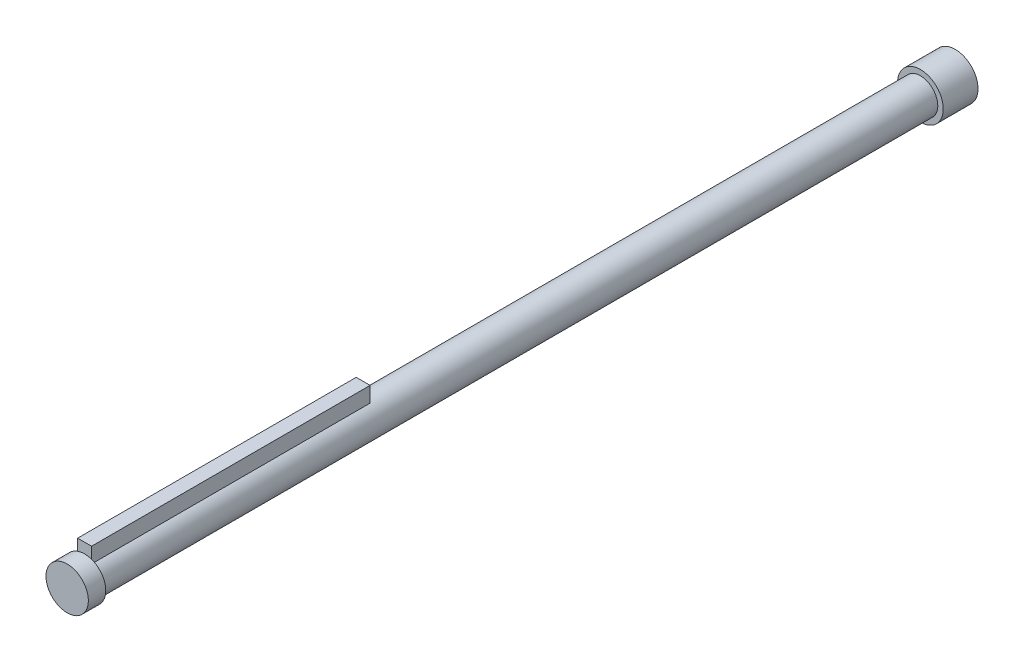
ISO-10303-21;
HEADER;
FILE_DESCRIPTION(('STEP AP214'),'2;1');
FILE_NAME('part.step','',(''),(''),'','','');
FILE_SCHEMA(('AUTOMOTIVE_DESIGN { 1 0 10303 214 1 1 1 1 }'));
ENDSEC;
DATA;
#1=APPLICATION_CONTEXT('core data for automotive mechanical design processes');
#2=APPLICATION_PROTOCOL_DEFINITION('international standard','automotive_design',2000,#1);
#3=PRODUCT_CONTEXT('',#1,'mechanical');
#4=PRODUCT('Part','Part','',(#3));
#5=PRODUCT_RELATED_PRODUCT_CATEGORY('part','',(#4));
#6=PRODUCT_DEFINITION_FORMATION('','',#4);
#7=PRODUCT_DEFINITION_CONTEXT('part definition',#1,'design');
#8=PRODUCT_DEFINITION('design','',#6,#7);
#9=PRODUCT_DEFINITION_SHAPE('','',#8);
#10=(LENGTH_UNIT() NAMED_UNIT(*) SI_UNIT(.MILLI.,.METRE.));
#11=(NAMED_UNIT(*) PLANE_ANGLE_UNIT() SI_UNIT($,.RADIAN.));
#12=(NAMED_UNIT(*) SI_UNIT($,.STERADIAN.) SOLID_ANGLE_UNIT());
#13=UNCERTAINTY_MEASURE_WITH_UNIT(LENGTH_MEASURE(1.E-05),#10,'distance_accuracy_value','');
#14=(GEOMETRIC_REPRESENTATION_CONTEXT(3) GLOBAL_UNCERTAINTY_ASSIGNED_CONTEXT((#13)) GLOBAL_UNIT_ASSIGNED_CONTEXT((#10,
#11,#12)) REPRESENTATION_CONTEXT('',''));
#15=CARTESIAN_POINT('',(0.,0.,0.));
#16=DIRECTION('',(0.,0.,1.));
#17=DIRECTION('',(1.,0.,0.));
#18=AXIS2_PLACEMENT_3D('',#15,#16,#17);
#19=CARTESIAN_POINT('',(0.,0.,152.4));
#20=DIRECTION('',(0.,0.,-1.));
#21=DIRECTION('',(-1.,0.,0.));
#22=AXIS2_PLACEMENT_3D('',#19,#20,#21);
#23=CYLINDRICAL_SURFACE('',#22,3.175);
#24=CARTESIAN_POINT('',(0.,0.,101.6));
#25=DIRECTION('',(0.,0.,1.));
#26=DIRECTION('',(1.,0.,0.));
#27=AXIS2_PLACEMENT_3D('',#24,#25,#26);
#28=CIRCLE('',#27,3.175);
#29=CARTESIAN_POINT('',(1.27,2.90993556629696,101.6));
#30=VERTEX_POINT('',#29);
#31=CARTESIAN_POINT('',(-1.27,2.90993556629696,101.6));
#32=VERTEX_POINT('',#31);
#33=EDGE_CURVE('E11',#30,#32,#28,.T.);
#34=ORIENTED_EDGE('',*,*,#33,.F.);
#35=DIRECTION('',(0.,0.,-1.));
#36=VECTOR('',#35,1.);
#37=CARTESIAN_POINT('',(1.27,2.90993556629696,152.4));
#38=LINE('',#37,#36);
#39=CARTESIAN_POINT('',(1.27,2.90993556629696,152.4));
#40=VERTEX_POINT('',#39);
#41=EDGE_CURVE('E141',#30,#40,#38,.F.);
#42=ORIENTED_EDGE('',*,*,#41,.T.);
#43=CARTESIAN_POINT('',(0.,0.,152.4));
#44=DIRECTION('',(0.,0.,1.));
#45=DIRECTION('',(1.,0.,0.));
#46=AXIS2_PLACEMENT_3D('',#43,#44,#45);
#47=CIRCLE('',#46,3.175);
#48=CARTESIAN_POINT('',(-1.27,2.90993556629696,152.4));
#49=VERTEX_POINT('',#48);
#50=EDGE_CURVE('E56',#49,#40,#47,.T.);
#51=ORIENTED_EDGE('',*,*,#50,.F.);
#52=DIRECTION('',(0.,0.,-1.));
#53=VECTOR('',#52,1.);
#54=CARTESIAN_POINT('',(-1.27,2.90993556629696,152.4));
#55=LINE('',#54,#53);
#56=EDGE_CURVE('E71',#49,#32,#55,.T.);
#57=ORIENTED_EDGE('',*,*,#56,.T.);
#58=EDGE_LOOP('',(#34,#42,#51,#57));
#59=FACE_BOUND('',#58,.T.);
#60=CARTESIAN_POINT('',(0.,0.,0.));
#61=DIRECTION('',(0.,0.,1.));
#62=DIRECTION('',(1.,0.,0.));
#63=AXIS2_PLACEMENT_3D('',#60,#61,#62);
#64=CIRCLE('',#63,3.175);
#65=CARTESIAN_POINT('',(3.175,0.,0.));
#66=VERTEX_POINT('',#65);
#67=EDGE_CURVE('E123',#66,#66,#64,.T.);
#68=ORIENTED_EDGE('',*,*,#67,.T.);
#69=EDGE_LOOP('',(#68));
#70=FACE_BOUND('',#69,.T.);
#71=ADVANCED_FACE('F49',(#59,#70),#23,.T.);
#72=CARTESIAN_POINT('',(0.,0.,152.4));
#73=DIRECTION('',(0.,0.,1.));
#74=DIRECTION('',(1.,0.,0.));
#75=AXIS2_PLACEMENT_3D('',#72,#73,#74);
#76=PLANE('',#75);
#77=CARTESIAN_POINT('',(0.,0.,152.4));
#78=DIRECTION('',(0.,0.,1.));
#79=DIRECTION('',(1.,0.,0.));
#80=AXIS2_PLACEMENT_3D('',#77,#78,#79);
#81=CIRCLE('',#80,3.8610491316399);
#82=CARTESIAN_POINT('',(1.27,3.64620355944881,152.4));
#83=VERTEX_POINT('',#82);
#84=CARTESIAN_POINT('',(-1.27,3.64620355944881,152.4));
#85=VERTEX_POINT('',#84);
#86=EDGE_CURVE('E63',#83,#85,#81,.T.);
#87=ORIENTED_EDGE('',*,*,#86,.F.);
#88=DIRECTION('',(0.,1.,0.));
#89=VECTOR('',#88,1.);
#90=CARTESIAN_POINT('',(1.27,5.715,152.4));
#91=LINE('',#90,#89);
#92=CARTESIAN_POINT('',(1.27,5.715,152.4));
#93=VERTEX_POINT('',#92);
#94=EDGE_CURVE('E134',#83,#93,#91,.T.);
#95=ORIENTED_EDGE('',*,*,#94,.T.);
#96=DIRECTION('',(-1.,0.,0.));
#97=VECTOR('',#96,1.);
#98=CARTESIAN_POINT('',(-1.27,5.715,152.4));
#99=LINE('',#98,#97);
#100=CARTESIAN_POINT('',(-1.27,5.715,152.4));
#101=VERTEX_POINT('',#100);
#102=EDGE_CURVE('E98',#93,#101,#99,.T.);
#103=ORIENTED_EDGE('',*,*,#102,.T.);
#104=DIRECTION('',(0.,-1.,0.));
#105=VECTOR('',#104,1.);
#106=CARTESIAN_POINT('',(-1.27,5.715,152.4));
#107=LINE('',#106,#105);
#108=EDGE_CURVE('E95',#101,#85,#107,.T.);
#109=ORIENTED_EDGE('',*,*,#108,.T.);
#110=EDGE_LOOP('',(#87,#95,#103,#109));
#111=FACE_BOUND('',#110,.T.);
#112=ADVANCED_FACE('F96',(#111),#76,.T.);
#113=CARTESIAN_POINT('',(1.27,5.715,101.6));
#114=DIRECTION('',(1.,0.,0.));
#115=DIRECTION('',(0.,1.,0.));
#116=AXIS2_PLACEMENT_3D('',#113,#114,#115);
#117=PLANE('',#116);
#118=ORIENTED_EDGE('',*,*,#41,.F.);
#119=DIRECTION('',(0.,1.,0.));
#120=VECTOR('',#119,1.);
#121=CARTESIAN_POINT('',(1.27,5.715,101.6));
#122=LINE('',#121,#120);
#123=CARTESIAN_POINT('',(1.27,5.715,101.6));
#124=VERTEX_POINT('',#123);
#125=EDGE_CURVE('E99',#30,#124,#122,.T.);
#126=ORIENTED_EDGE('',*,*,#125,.T.);
#127=DIRECTION('',(0.,0.,1.));
#128=VECTOR('',#127,1.);
#129=CARTESIAN_POINT('',(1.27,5.715,101.6));
#130=LINE('',#129,#128);
#131=EDGE_CURVE('E132',#124,#93,#130,.T.);
#132=ORIENTED_EDGE('',*,*,#131,.T.);
#133=ORIENTED_EDGE('',*,*,#94,.F.);
#134=EDGE_CURVE('E111',#40,#83,#91,.T.);
#135=ORIENTED_EDGE('',*,*,#134,.F.);
#136=EDGE_LOOP('',(#118,#126,#132,#133,#135));
#137=FACE_BOUND('',#136,.T.);
#138=ADVANCED_FACE('F149',(#137),#117,.T.);
#139=CARTESIAN_POINT('',(-1.27,5.715,101.6));
#140=DIRECTION('',(-1.,0.,0.));
#141=DIRECTION('',(0.,-1.,0.));
#142=AXIS2_PLACEMENT_3D('',#139,#140,#141);
#143=PLANE('',#142);
#144=ORIENTED_EDGE('',*,*,#56,.F.);
#145=EDGE_CURVE('E100',#85,#49,#107,.T.);
#146=ORIENTED_EDGE('',*,*,#145,.F.);
#147=ORIENTED_EDGE('',*,*,#108,.F.);
#148=DIRECTION('',(0.,0.,1.));
#149=VECTOR('',#148,1.);
#150=CARTESIAN_POINT('',(-1.27,5.715,101.6));
#151=LINE('',#150,#149);
#152=CARTESIAN_POINT('',(-1.27,5.715,101.6));
#153=VERTEX_POINT('',#152);
#154=EDGE_CURVE('E136',#153,#101,#151,.T.);
#155=ORIENTED_EDGE('',*,*,#154,.F.);
#156=DIRECTION('',(0.,-1.,0.));
#157=VECTOR('',#156,1.);
#158=CARTESIAN_POINT('',(-1.27,5.715,101.6));
#159=LINE('',#158,#157);
#160=EDGE_CURVE('E130',#153,#32,#159,.T.);
#161=ORIENTED_EDGE('',*,*,#160,.T.);
#162=EDGE_LOOP('',(#144,#146,#147,#155,#161));
#163=FACE_BOUND('',#162,.T.);
#164=ADVANCED_FACE('F104',(#163),#143,.T.);
#165=CARTESIAN_POINT('',(-1.27,5.715,101.6));
#166=DIRECTION('',(0.,1.,0.));
#167=DIRECTION('',(0.,0.,1.));
#168=AXIS2_PLACEMENT_3D('',#165,#166,#167);
#169=PLANE('',#168);
#170=ORIENTED_EDGE('',*,*,#102,.F.);
#171=ORIENTED_EDGE('',*,*,#131,.F.);
#172=DIRECTION('',(-1.,0.,0.));
#173=VECTOR('',#172,1.);
#174=CARTESIAN_POINT('',(-1.27,5.715,101.6));
#175=LINE('',#174,#173);
#176=EDGE_CURVE('E127',#124,#153,#175,.T.);
#177=ORIENTED_EDGE('',*,*,#176,.T.);
#178=ORIENTED_EDGE('',*,*,#154,.T.);
#179=EDGE_LOOP('',(#170,#171,#177,#178));
#180=FACE_BOUND('',#179,.T.);
#181=ADVANCED_FACE('F153',(#180),#169,.T.);
#182=CARTESIAN_POINT('',(0.,0.,101.6));
#183=DIRECTION('',(0.,0.,1.));
#184=DIRECTION('',(1.,0.,0.));
#185=AXIS2_PLACEMENT_3D('',#182,#183,#184);
#186=PLANE('',#185);
#187=ORIENTED_EDGE('',*,*,#125,.F.);
#188=ORIENTED_EDGE('',*,*,#33,.T.);
#189=ORIENTED_EDGE('',*,*,#160,.F.);
#190=ORIENTED_EDGE('',*,*,#176,.F.);
#191=EDGE_LOOP('',(#187,#188,#189,#190));
#192=FACE_BOUND('',#191,.T.);
#193=ADVANCED_FACE('F156',(#192),#186,.F.);
#194=CARTESIAN_POINT('',(0.,0.,-6.35));
#195=DIRECTION('',(0.,0.,1.));
#196=DIRECTION('',(1.,0.,0.));
#197=AXIS2_PLACEMENT_3D('',#194,#195,#196);
#198=CYLINDRICAL_SURFACE('',#197,4.16256809349602);
#199=CARTESIAN_POINT('',(0.,0.,-6.35));
#200=DIRECTION('',(0.,0.,-1.));
#201=DIRECTION('',(-1.,0.,0.));
#202=AXIS2_PLACEMENT_3D('',#199,#200,#201);
#203=CIRCLE('',#202,4.16256809349602);
#204=CARTESIAN_POINT('',(-4.16256809349602,0.,-6.35));
#205=VERTEX_POINT('',#204);
#206=EDGE_CURVE('E120',#205,#205,#203,.T.);
#207=ORIENTED_EDGE('',*,*,#206,.F.);
#208=EDGE_LOOP('',(#207));
#209=FACE_BOUND('',#208,.T.);
#210=CARTESIAN_POINT('',(0.,0.,0.));
#211=DIRECTION('',(0.,0.,-1.));
#212=DIRECTION('',(-1.,0.,0.));
#213=AXIS2_PLACEMENT_3D('',#210,#211,#212);
#214=CIRCLE('',#213,4.16256809349602);
#215=CARTESIAN_POINT('',(-4.16256809349602,0.,0.));
#216=VERTEX_POINT('',#215);
#217=EDGE_CURVE('E117',#216,#216,#214,.T.);
#218=ORIENTED_EDGE('',*,*,#217,.T.);
#219=EDGE_LOOP('',(#218));
#220=FACE_BOUND('',#219,.T.);
#221=ADVANCED_FACE('F175',(#209,#220),#198,.T.);
#222=CARTESIAN_POINT('',(0.,0.,-6.35));
#223=DIRECTION('',(0.,0.,-1.));
#224=DIRECTION('',(-1.,0.,0.));
#225=AXIS2_PLACEMENT_3D('',#222,#223,#224);
#226=PLANE('',#225);
#227=ORIENTED_EDGE('',*,*,#206,.T.);
#228=EDGE_LOOP('',(#227));
#229=FACE_BOUND('',#228,.T.);
#230=ADVANCED_FACE('F178',(#229),#226,.T.);
#231=CARTESIAN_POINT('',(0.,0.,0.));
#232=DIRECTION('',(0.,0.,-1.));
#233=DIRECTION('',(-1.,0.,0.));
#234=AXIS2_PLACEMENT_3D('',#231,#232,#233);
#235=PLANE('',#234);
#236=ORIENTED_EDGE('',*,*,#67,.F.);
#237=EDGE_LOOP('',(#236));
#238=FACE_BOUND('',#237,.T.);
#239=ORIENTED_EDGE('',*,*,#217,.F.);
#240=EDGE_LOOP('',(#239));
#241=FACE_BOUND('',#240,.T.);
#242=ADVANCED_FACE('F180',(#238,#241),#235,.F.);
#243=CARTESIAN_POINT('',(0.,0.,152.4));
#244=DIRECTION('',(0.,0.,1.));
#245=DIRECTION('',(1.,0.,0.));
#246=AXIS2_PLACEMENT_3D('',#243,#244,#245);
#247=PLANE('',#246);
#248=ORIENTED_EDGE('',*,*,#50,.T.);
#249=ORIENTED_EDGE('',*,*,#134,.T.);
#250=EDGE_CURVE('E109',#85,#83,#81,.T.);
#251=ORIENTED_EDGE('',*,*,#250,.F.);
#252=ORIENTED_EDGE('',*,*,#145,.T.);
#253=EDGE_LOOP('',(#248,#249,#251,#252));
#254=FACE_BOUND('',#253,.T.);
#255=ADVANCED_FACE('F110',(#254),#247,.F.);
#256=CARTESIAN_POINT('',(0.,0.,155.575));
#257=DIRECTION('',(0.,0.,-1.));
#258=DIRECTION('',(-1.,0.,0.));
#259=AXIS2_PLACEMENT_3D('',#256,#257,#258);
#260=CYLINDRICAL_SURFACE('',#259,3.8610491316399);
#261=CARTESIAN_POINT('',(0.,0.,155.575));
#262=DIRECTION('',(0.,0.,1.));
#263=DIRECTION('',(1.,0.,0.));
#264=AXIS2_PLACEMENT_3D('',#261,#262,#263);
#265=CIRCLE('',#264,3.8610491316399);
#266=CARTESIAN_POINT('',(3.8610491316399,0.,155.575));
#267=VERTEX_POINT('',#266);
#268=EDGE_CURVE('E115',#267,#267,#265,.T.);
#269=ORIENTED_EDGE('',*,*,#268,.F.);
#270=EDGE_LOOP('',(#269));
#271=FACE_BOUND('',#270,.T.);
#272=ORIENTED_EDGE('',*,*,#86,.T.);
#273=ORIENTED_EDGE('',*,*,#250,.T.);
#274=EDGE_LOOP('',(#272,#273));
#275=FACE_BOUND('',#274,.T.);
#276=ADVANCED_FACE('F114',(#271,#275),#260,.T.);
#277=CARTESIAN_POINT('',(0.,0.,155.575));
#278=DIRECTION('',(0.,0.,1.));
#279=DIRECTION('',(1.,0.,0.));
#280=AXIS2_PLACEMENT_3D('',#277,#278,#279);
#281=PLANE('',#280);
#282=ORIENTED_EDGE('',*,*,#268,.T.);
#283=EDGE_LOOP('',(#282));
#284=FACE_BOUND('',#283,.T.);
#285=ADVANCED_FACE('F188',(#284),#281,.T.);
#286=CLOSED_SHELL('',(#71,#112,#138,#164,#181,#193,#221,#230,#242,#255,#276,#285));
#287=MANIFOLD_SOLID_BREP('B2',#286);
#288=ADVANCED_BREP_SHAPE_REPRESENTATION('',(#18,#287),#14);
#289=SHAPE_DEFINITION_REPRESENTATION(#9,#288);
ENDSEC;
END-ISO-10303-21;
